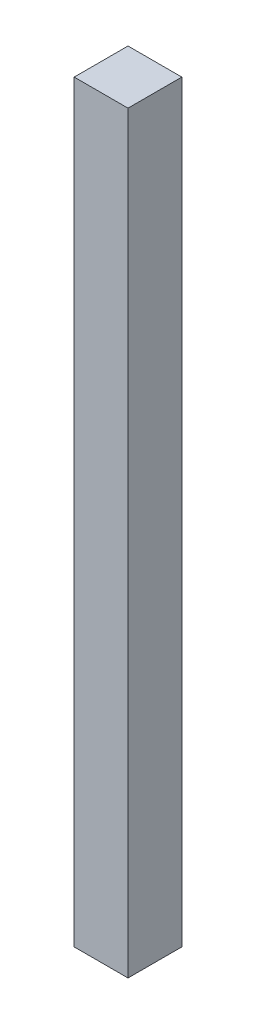
ISO-10303-21;
HEADER;
FILE_DESCRIPTION(('STEP AP214'),'2;1');
FILE_NAME('part.step','',(''),(''),'','','');
FILE_SCHEMA(('AUTOMOTIVE_DESIGN { 1 0 10303 214 1 1 1 1 }'));
ENDSEC;
DATA;
#1=APPLICATION_CONTEXT('core data for automotive mechanical design processes');
#2=APPLICATION_PROTOCOL_DEFINITION('international standard','automotive_design',2000,#1);
#3=PRODUCT_CONTEXT('',#1,'mechanical');
#4=PRODUCT('Part','Part','',(#3));
#5=PRODUCT_RELATED_PRODUCT_CATEGORY('part','',(#4));
#6=PRODUCT_DEFINITION_FORMATION('','',#4);
#7=PRODUCT_DEFINITION_CONTEXT('part definition',#1,'design');
#8=PRODUCT_DEFINITION('design','',#6,#7);
#9=PRODUCT_DEFINITION_SHAPE('','',#8);
#10=(LENGTH_UNIT() NAMED_UNIT(*) SI_UNIT(.MILLI.,.METRE.));
#11=(NAMED_UNIT(*) PLANE_ANGLE_UNIT() SI_UNIT($,.RADIAN.));
#12=(NAMED_UNIT(*) SI_UNIT($,.STERADIAN.) SOLID_ANGLE_UNIT());
#13=UNCERTAINTY_MEASURE_WITH_UNIT(LENGTH_MEASURE(1.E-05),#10,'distance_accuracy_value','');
#14=(GEOMETRIC_REPRESENTATION_CONTEXT(3) GLOBAL_UNCERTAINTY_ASSIGNED_CONTEXT((#13)) GLOBAL_UNIT_ASSIGNED_CONTEXT((#10,
#11,#12)) REPRESENTATION_CONTEXT('',''));
#15=CARTESIAN_POINT('',(0.,0.,0.));
#16=DIRECTION('',(0.,0.,1.));
#17=DIRECTION('',(1.,0.,0.));
#18=AXIS2_PLACEMENT_3D('',#15,#16,#17);
#19=CARTESIAN_POINT('',(12.7,177.8,12.7));
#20=DIRECTION('',(-1.,0.,0.));
#21=DIRECTION('',(0.,0.,1.));
#22=AXIS2_PLACEMENT_3D('',#19,#20,#21);
#23=PLANE('',#22);
#24=DIRECTION('',(0.,0.,-1.));
#25=VECTOR('',#24,1.);
#26=CARTESIAN_POINT('',(12.7,-177.8,12.7));
#27=LINE('',#26,#25);
#28=CARTESIAN_POINT('',(12.7,-177.8,12.7));
#29=VERTEX_POINT('',#28);
#30=CARTESIAN_POINT('',(12.7,-177.8,-12.7));
#31=VERTEX_POINT('',#30);
#32=EDGE_CURVE('E107',#29,#31,#27,.T.);
#33=ORIENTED_EDGE('',*,*,#32,.T.);
#34=DIRECTION('',(0.,-1.,0.));
#35=VECTOR('',#34,1.);
#36=CARTESIAN_POINT('',(12.7,177.8,-12.7));
#37=LINE('',#36,#35);
#38=CARTESIAN_POINT('',(12.7,177.8,-12.7));
#39=VERTEX_POINT('',#38);
#40=EDGE_CURVE('E11',#39,#31,#37,.T.);
#41=ORIENTED_EDGE('',*,*,#40,.F.);
#42=DIRECTION('',(0.,0.,-1.));
#43=VECTOR('',#42,1.);
#44=CARTESIAN_POINT('',(12.7,177.8,12.7));
#45=LINE('',#44,#43);
#46=CARTESIAN_POINT('',(12.7,177.8,12.7));
#47=VERTEX_POINT('',#46);
#48=EDGE_CURVE('E91',#47,#39,#45,.T.);
#49=ORIENTED_EDGE('',*,*,#48,.F.);
#50=DIRECTION('',(0.,-1.,0.));
#51=VECTOR('',#50,1.);
#52=CARTESIAN_POINT('',(12.7,177.8,12.7));
#53=LINE('',#52,#51);
#54=EDGE_CURVE('E103',#47,#29,#53,.T.);
#55=ORIENTED_EDGE('',*,*,#54,.T.);
#56=EDGE_LOOP('',(#33,#41,#49,#55));
#57=FACE_BOUND('',#56,.T.);
#58=ADVANCED_FACE('F39',(#57),#23,.F.);
#59=CARTESIAN_POINT('',(-12.7,177.8,-12.7));
#60=DIRECTION('',(0.,0.,1.));
#61=DIRECTION('',(1.,0.,0.));
#62=AXIS2_PLACEMENT_3D('',#59,#60,#61);
#63=PLANE('',#62);
#64=DIRECTION('',(-1.,0.,0.));
#65=VECTOR('',#64,1.);
#66=CARTESIAN_POINT('',(-12.7,-177.8,-12.7));
#67=LINE('',#66,#65);
#68=CARTESIAN_POINT('',(-12.7,-177.8,-12.7));
#69=VERTEX_POINT('',#68);
#70=EDGE_CURVE('E96',#31,#69,#67,.T.);
#71=ORIENTED_EDGE('',*,*,#70,.T.);
#72=DIRECTION('',(0.,-1.,0.));
#73=VECTOR('',#72,1.);
#74=CARTESIAN_POINT('',(-12.7,177.8,-12.7));
#75=LINE('',#74,#73);
#76=CARTESIAN_POINT('',(-12.7,177.8,-12.7));
#77=VERTEX_POINT('',#76);
#78=EDGE_CURVE('E48',#77,#69,#75,.T.);
#79=ORIENTED_EDGE('',*,*,#78,.F.);
#80=DIRECTION('',(-1.,0.,0.));
#81=VECTOR('',#80,1.);
#82=CARTESIAN_POINT('',(-12.7,177.8,-12.7));
#83=LINE('',#82,#81);
#84=EDGE_CURVE('E86',#39,#77,#83,.T.);
#85=ORIENTED_EDGE('',*,*,#84,.F.);
#86=ORIENTED_EDGE('',*,*,#40,.T.);
#87=EDGE_LOOP('',(#71,#79,#85,#86));
#88=FACE_BOUND('',#87,.T.);
#89=ADVANCED_FACE('F95',(#88),#63,.F.);
#90=CARTESIAN_POINT('',(-12.7,177.8,12.7));
#91=DIRECTION('',(1.,0.,0.));
#92=DIRECTION('',(0.,0.,-1.));
#93=AXIS2_PLACEMENT_3D('',#90,#91,#92);
#94=PLANE('',#93);
#95=DIRECTION('',(0.,0.,1.));
#96=VECTOR('',#95,1.);
#97=CARTESIAN_POINT('',(-12.7,-177.8,12.7));
#98=LINE('',#97,#96);
#99=CARTESIAN_POINT('',(-12.7,-177.8,12.7));
#100=VERTEX_POINT('',#99);
#101=EDGE_CURVE('E73',#69,#100,#98,.T.);
#102=ORIENTED_EDGE('',*,*,#101,.T.);
#103=DIRECTION('',(0.,-1.,0.));
#104=VECTOR('',#103,1.);
#105=CARTESIAN_POINT('',(-12.7,177.8,12.7));
#106=LINE('',#105,#104);
#107=CARTESIAN_POINT('',(-12.7,177.8,12.7));
#108=VERTEX_POINT('',#107);
#109=EDGE_CURVE('E98',#108,#100,#106,.T.);
#110=ORIENTED_EDGE('',*,*,#109,.F.);
#111=DIRECTION('',(0.,0.,1.));
#112=VECTOR('',#111,1.);
#113=CARTESIAN_POINT('',(-12.7,177.8,12.7));
#114=LINE('',#113,#112);
#115=EDGE_CURVE('E89',#77,#108,#114,.T.);
#116=ORIENTED_EDGE('',*,*,#115,.F.);
#117=ORIENTED_EDGE('',*,*,#78,.T.);
#118=EDGE_LOOP('',(#102,#110,#116,#117));
#119=FACE_BOUND('',#118,.T.);
#120=ADVANCED_FACE('F99',(#119),#94,.F.);
#121=CARTESIAN_POINT('',(-12.7,177.8,12.7));
#122=DIRECTION('',(0.,0.,-1.));
#123=DIRECTION('',(-1.,0.,0.));
#124=AXIS2_PLACEMENT_3D('',#121,#122,#123);
#125=PLANE('',#124);
#126=DIRECTION('',(1.,0.,0.));
#127=VECTOR('',#126,1.);
#128=CARTESIAN_POINT('',(-12.7,-177.8,12.7));
#129=LINE('',#128,#127);
#130=EDGE_CURVE('E79',#100,#29,#129,.T.);
#131=ORIENTED_EDGE('',*,*,#130,.T.);
#132=ORIENTED_EDGE('',*,*,#54,.F.);
#133=DIRECTION('',(1.,0.,0.));
#134=VECTOR('',#133,1.);
#135=CARTESIAN_POINT('',(-12.7,177.8,12.7));
#136=LINE('',#135,#134);
#137=EDGE_CURVE('E56',#108,#47,#136,.T.);
#138=ORIENTED_EDGE('',*,*,#137,.F.);
#139=ORIENTED_EDGE('',*,*,#109,.T.);
#140=EDGE_LOOP('',(#131,#132,#138,#139));
#141=FACE_BOUND('',#140,.T.);
#142=ADVANCED_FACE('F120',(#141),#125,.F.);
#143=CARTESIAN_POINT('',(0.,177.8,0.));
#144=DIRECTION('',(0.,-1.,0.));
#145=DIRECTION('',(0.,0.,-1.));
#146=AXIS2_PLACEMENT_3D('',#143,#144,#145);
#147=PLANE('',#146);
#148=ORIENTED_EDGE('',*,*,#48,.T.);
#149=ORIENTED_EDGE('',*,*,#84,.T.);
#150=ORIENTED_EDGE('',*,*,#115,.T.);
#151=ORIENTED_EDGE('',*,*,#137,.T.);
#152=EDGE_LOOP('',(#148,#149,#150,#151));
#153=FACE_BOUND('',#152,.T.);
#154=ADVANCED_FACE('F87',(#153),#147,.F.);
#155=CARTESIAN_POINT('',(0.,-177.8,0.));
#156=DIRECTION('',(0.,-1.,0.));
#157=DIRECTION('',(0.,0.,-1.));
#158=AXIS2_PLACEMENT_3D('',#155,#156,#157);
#159=PLANE('',#158);
#160=ORIENTED_EDGE('',*,*,#32,.F.);
#161=ORIENTED_EDGE('',*,*,#130,.F.);
#162=ORIENTED_EDGE('',*,*,#101,.F.);
#163=ORIENTED_EDGE('',*,*,#70,.F.);
#164=EDGE_LOOP('',(#160,#161,#162,#163));
#165=FACE_BOUND('',#164,.T.);
#166=ADVANCED_FACE('F123',(#165),#159,.T.);
#167=CLOSED_SHELL('',(#58,#89,#120,#142,#154,#166));
#168=MANIFOLD_SOLID_BREP('B2',#167);
#169=ADVANCED_BREP_SHAPE_REPRESENTATION('',(#18,#168),#14);
#170=SHAPE_DEFINITION_REPRESENTATION(#9,#169);
ENDSEC;
END-ISO-10303-21;
